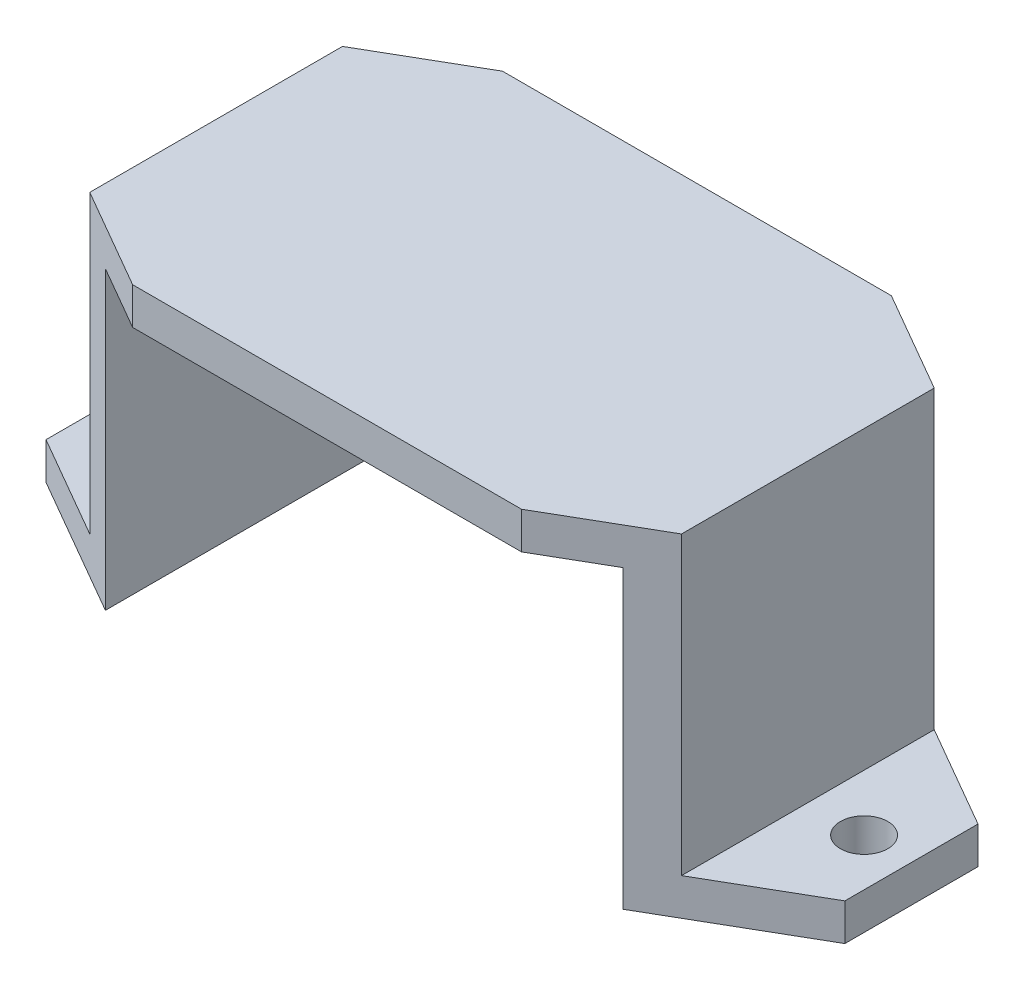
ISO-10303-21;
HEADER;
FILE_DESCRIPTION(('STEP AP214'),'2;1');
FILE_NAME('part.step','',(''),(''),'','','');
FILE_SCHEMA(('AUTOMOTIVE_DESIGN { 1 0 10303 214 1 1 1 1 }'));
ENDSEC;
DATA;
#1=APPLICATION_CONTEXT('core data for automotive mechanical design processes');
#2=APPLICATION_PROTOCOL_DEFINITION('international standard','automotive_design',2000,#1);
#3=PRODUCT_CONTEXT('',#1,'mechanical');
#4=PRODUCT('Part','Part','',(#3));
#5=PRODUCT_RELATED_PRODUCT_CATEGORY('part','',(#4));
#6=PRODUCT_DEFINITION_FORMATION('','',#4);
#7=PRODUCT_DEFINITION_CONTEXT('part definition',#1,'design');
#8=PRODUCT_DEFINITION('design','',#6,#7);
#9=PRODUCT_DEFINITION_SHAPE('','',#8);
#10=(LENGTH_UNIT() NAMED_UNIT(*) SI_UNIT(.MILLI.,.METRE.));
#11=(NAMED_UNIT(*) PLANE_ANGLE_UNIT() SI_UNIT($,.RADIAN.));
#12=(NAMED_UNIT(*) SI_UNIT($,.STERADIAN.) SOLID_ANGLE_UNIT());
#13=UNCERTAINTY_MEASURE_WITH_UNIT(LENGTH_MEASURE(1.E-05),#10,'distance_accuracy_value','');
#14=(GEOMETRIC_REPRESENTATION_CONTEXT(3) GLOBAL_UNCERTAINTY_ASSIGNED_CONTEXT((#13)) GLOBAL_UNIT_ASSIGNED_CONTEXT((#10,
#11,#12)) REPRESENTATION_CONTEXT('',''));
#15=CARTESIAN_POINT('',(0.,0.,0.));
#16=DIRECTION('',(0.,0.,1.));
#17=DIRECTION('',(1.,0.,0.));
#18=AXIS2_PLACEMENT_3D('',#15,#16,#17);
#19=CARTESIAN_POINT('',(47.,-2.5,25.));
#20=DIRECTION('',(0.,1.,0.));
#21=DIRECTION('',(0.,0.,1.));
#22=AXIS2_PLACEMENT_3D('',#19,#20,#21);
#23=PLANE('',#22);
#24=CARTESIAN_POINT('',(50.8,-2.5,12.5));
#25=DIRECTION('',(0.,1.,0.));
#26=DIRECTION('',(0.,0.,1.));
#27=AXIS2_PLACEMENT_3D('',#24,#25,#26);
#28=CIRCLE('',#27,1.6);
#29=CARTESIAN_POINT('',(50.8,-2.5,14.1));
#30=VERTEX_POINT('',#29);
#31=EDGE_CURVE('E297',#30,#30,#28,.T.);
#32=ORIENTED_EDGE('',*,*,#31,.T.);
#33=EDGE_LOOP('',(#32));
#34=FACE_BOUND('',#33,.T.);
#35=DIRECTION('',(0.,0.,-1.));
#36=VECTOR('',#35,1.);
#37=CARTESIAN_POINT('',(44.5,-2.5,25.));
#38=LINE('',#37,#36);
#39=CARTESIAN_POINT('',(44.5,-2.5,22.4848275573014));
#40=VERTEX_POINT('',#39);
#41=CARTESIAN_POINT('',(44.5,-2.5,2.51517244269858));
#42=VERTEX_POINT('',#41);
#43=EDGE_CURVE('E176',#40,#42,#38,.T.);
#44=ORIENTED_EDGE('',*,*,#43,.T.);
#45=DIRECTION('',(0.86602540378444,0.,0.499999999999998));
#46=VECTOR('',#45,1.);
#47=CARTESIAN_POINT('',(54.,-2.5,8.));
#48=LINE('',#47,#46);
#49=CARTESIAN_POINT('',(54.,-2.5,8.));
#50=VERTEX_POINT('',#49);
#51=EDGE_CURVE('E234',#42,#50,#48,.T.);
#52=ORIENTED_EDGE('',*,*,#51,.T.);
#53=DIRECTION('',(0.,0.,-1.));
#54=VECTOR('',#53,1.);
#55=CARTESIAN_POINT('',(54.,-2.5,25.));
#56=LINE('',#55,#54);
#57=CARTESIAN_POINT('',(54.,-2.5,17.));
#58=VERTEX_POINT('',#57);
#59=EDGE_CURVE('E217',#58,#50,#56,.T.);
#60=ORIENTED_EDGE('',*,*,#59,.F.);
#61=DIRECTION('',(-0.86602540378444,0.,0.499999999999998));
#62=VECTOR('',#61,1.);
#63=CARTESIAN_POINT('',(54.,-2.5,17.));
#64=LINE('',#63,#62);
#65=EDGE_CURVE('E304',#58,#40,#64,.T.);
#66=ORIENTED_EDGE('',*,*,#65,.T.);
#67=EDGE_LOOP('',(#44,#52,#60,#66));
#68=FACE_BOUND('',#67,.T.);
#69=ADVANCED_FACE('F43',(#34,#68),#23,.F.);
#70=CARTESIAN_POINT('',(54.,0.,25.));
#71=DIRECTION('',(1.,0.,0.));
#72=DIRECTION('',(0.,0.,-1.));
#73=AXIS2_PLACEMENT_3D('',#70,#71,#72);
#74=PLANE('',#73);
#75=DIRECTION('',(0.,1.,0.));
#76=VECTOR('',#75,1.);
#77=CARTESIAN_POINT('',(54.,-2.5,8.));
#78=LINE('',#77,#76);
#79=CARTESIAN_POINT('',(54.,0.,8.));
#80=VERTEX_POINT('',#79);
#81=EDGE_CURVE('E292',#50,#80,#78,.T.);
#82=ORIENTED_EDGE('',*,*,#81,.T.);
#83=DIRECTION('',(0.,0.,-1.));
#84=VECTOR('',#83,1.);
#85=CARTESIAN_POINT('',(54.,0.,25.));
#86=LINE('',#85,#84);
#87=CARTESIAN_POINT('',(54.,0.,17.));
#88=VERTEX_POINT('',#87);
#89=EDGE_CURVE('E214',#88,#80,#86,.T.);
#90=ORIENTED_EDGE('',*,*,#89,.F.);
#91=DIRECTION('',(0.,1.,0.));
#92=VECTOR('',#91,1.);
#93=CARTESIAN_POINT('',(54.,-2.5,17.));
#94=LINE('',#93,#92);
#95=EDGE_CURVE('E233',#58,#88,#94,.T.);
#96=ORIENTED_EDGE('',*,*,#95,.F.);
#97=ORIENTED_EDGE('',*,*,#59,.T.);
#98=EDGE_LOOP('',(#82,#90,#96,#97));
#99=FACE_BOUND('',#98,.T.);
#100=ADVANCED_FACE('F295',(#99),#74,.T.);
#101=CARTESIAN_POINT('',(47.,0.,25.));
#102=DIRECTION('',(0.,1.,0.));
#103=DIRECTION('',(0.,0.,1.));
#104=AXIS2_PLACEMENT_3D('',#101,#102,#103);
#105=PLANE('',#104);
#106=CARTESIAN_POINT('',(50.8,0.,12.5));
#107=DIRECTION('',(0.,1.,0.));
#108=DIRECTION('',(0.,0.,1.));
#109=AXIS2_PLACEMENT_3D('',#106,#107,#108);
#110=CIRCLE('',#109,1.6);
#111=CARTESIAN_POINT('',(50.8,0.,14.1));
#112=VERTEX_POINT('',#111);
#113=EDGE_CURVE('E301',#112,#112,#110,.T.);
#114=ORIENTED_EDGE('',*,*,#113,.F.);
#115=EDGE_LOOP('',(#114));
#116=FACE_BOUND('',#115,.T.);
#117=DIRECTION('',(0.86602540378444,0.,0.499999999999998));
#118=VECTOR('',#117,1.);
#119=CARTESIAN_POINT('',(56.1112159321677,0.,9.21891108675444));
#120=LINE('',#119,#118);
#121=CARTESIAN_POINT('',(47.,0.,3.95854811567264));
#122=VERTEX_POINT('',#121);
#123=EDGE_CURVE('E264',#122,#80,#120,.T.);
#124=ORIENTED_EDGE('',*,*,#123,.F.);
#125=DIRECTION('',(0.,0.,-1.));
#126=VECTOR('',#125,1.);
#127=CARTESIAN_POINT('',(47.,0.,25.));
#128=LINE('',#127,#126);
#129=CARTESIAN_POINT('',(47.,0.,21.0414518843274));
#130=VERTEX_POINT('',#129);
#131=EDGE_CURVE('E211',#130,#122,#128,.T.);
#132=ORIENTED_EDGE('',*,*,#131,.F.);
#133=DIRECTION('',(-0.86602540378444,0.,0.499999999999998));
#134=VECTOR('',#133,1.);
#135=CARTESIAN_POINT('',(45.2858983848622,0.,22.0310889132455));
#136=LINE('',#135,#134);
#137=EDGE_CURVE('E182',#88,#130,#136,.T.);
#138=ORIENTED_EDGE('',*,*,#137,.F.);
#139=ORIENTED_EDGE('',*,*,#89,.T.);
#140=EDGE_LOOP('',(#124,#132,#138,#139));
#141=FACE_BOUND('',#140,.T.);
#142=ADVANCED_FACE('F290',(#116,#141),#105,.T.);
#143=CARTESIAN_POINT('',(47.,20.,25.));
#144=DIRECTION('',(1.,0.,0.));
#145=DIRECTION('',(0.,0.,-1.));
#146=AXIS2_PLACEMENT_3D('',#143,#144,#145);
#147=PLANE('',#146);
#148=DIRECTION('',(0.,-1.,0.));
#149=VECTOR('',#148,1.);
#150=CARTESIAN_POINT('',(47.,20.,3.95854811567264));
#151=LINE('',#150,#149);
#152=CARTESIAN_POINT('',(47.,20.,3.95854811567264));
#153=VERTEX_POINT('',#152);
#154=EDGE_CURVE('E262',#153,#122,#151,.T.);
#155=ORIENTED_EDGE('',*,*,#154,.F.);
#156=DIRECTION('',(0.,0.,-1.));
#157=VECTOR('',#156,1.);
#158=CARTESIAN_POINT('',(47.,20.,25.));
#159=LINE('',#158,#157);
#160=CARTESIAN_POINT('',(47.,20.,21.0414518843274));
#161=VERTEX_POINT('',#160);
#162=EDGE_CURVE('E208',#161,#153,#159,.T.);
#163=ORIENTED_EDGE('',*,*,#162,.F.);
#164=DIRECTION('',(0.,1.,0.));
#165=VECTOR('',#164,1.);
#166=CARTESIAN_POINT('',(47.,20.,21.0414518843274));
#167=LINE('',#166,#165);
#168=EDGE_CURVE('E279',#130,#161,#167,.T.);
#169=ORIENTED_EDGE('',*,*,#168,.F.);
#170=ORIENTED_EDGE('',*,*,#131,.T.);
#171=EDGE_LOOP('',(#155,#163,#169,#170));
#172=FACE_BOUND('',#171,.T.);
#173=ADVANCED_FACE('F288',(#172),#147,.T.);
#174=CARTESIAN_POINT('',(7.,20.,25.));
#175=DIRECTION('',(0.,1.,0.));
#176=DIRECTION('',(0.,0.,1.));
#177=AXIS2_PLACEMENT_3D('',#174,#175,#176);
#178=PLANE('',#177);
#179=DIRECTION('',(0.86602540378444,0.,0.499999999999998));
#180=VECTOR('',#179,1.);
#181=CARTESIAN_POINT('',(54.,20.,8.));
#182=LINE('',#181,#180);
#183=CARTESIAN_POINT('',(40.1435935394489,20.,0.));
#184=VERTEX_POINT('',#183);
#185=EDGE_CURVE('E225',#184,#153,#182,.T.);
#186=ORIENTED_EDGE('',*,*,#185,.F.);
#187=DIRECTION('',(1.,0.,0.));
#188=VECTOR('',#187,1.);
#189=CARTESIAN_POINT('',(7.,20.,0.));
#190=LINE('',#189,#188);
#191=CARTESIAN_POINT('',(13.8564064605511,20.,0.));
#192=VERTEX_POINT('',#191);
#193=EDGE_CURVE('E179',#192,#184,#190,.T.);
#194=ORIENTED_EDGE('',*,*,#193,.F.);
#195=DIRECTION('',(0.86602540378444,0.,-0.499999999999998));
#196=VECTOR('',#195,1.);
#197=CARTESIAN_POINT('',(0.,20.,8.));
#198=LINE('',#197,#196);
#199=CARTESIAN_POINT('',(7.,20.,3.95854811567264));
#200=VERTEX_POINT('',#199);
#201=EDGE_CURVE('E169',#200,#192,#198,.T.);
#202=ORIENTED_EDGE('',*,*,#201,.F.);
#203=DIRECTION('',(0.,0.,-1.));
#204=VECTOR('',#203,1.);
#205=CARTESIAN_POINT('',(7.,20.,25.));
#206=LINE('',#205,#204);
#207=CARTESIAN_POINT('',(7.,20.,21.0414518843274));
#208=VERTEX_POINT('',#207);
#209=EDGE_CURVE('E168',#208,#200,#206,.T.);
#210=ORIENTED_EDGE('',*,*,#209,.F.);
#211=DIRECTION('',(-0.86602540378444,0.,-0.499999999999998));
#212=VECTOR('',#211,1.);
#213=CARTESIAN_POINT('',(0.,20.,17.));
#214=LINE('',#213,#212);
#215=CARTESIAN_POINT('',(13.8564064605511,20.,25.));
#216=VERTEX_POINT('',#215);
#217=EDGE_CURVE('E153',#216,#208,#214,.T.);
#218=ORIENTED_EDGE('',*,*,#217,.F.);
#219=DIRECTION('',(1.,0.,0.));
#220=VECTOR('',#219,1.);
#221=CARTESIAN_POINT('',(7.,20.,25.));
#222=LINE('',#221,#220);
#223=CARTESIAN_POINT('',(40.1435935394489,20.,25.));
#224=VERTEX_POINT('',#223);
#225=EDGE_CURVE('E165',#216,#224,#222,.T.);
#226=ORIENTED_EDGE('',*,*,#225,.T.);
#227=DIRECTION('',(-0.86602540378444,0.,0.499999999999998));
#228=VECTOR('',#227,1.);
#229=CARTESIAN_POINT('',(54.,20.,17.));
#230=LINE('',#229,#228);
#231=EDGE_CURVE('E65',#161,#224,#230,.T.);
#232=ORIENTED_EDGE('',*,*,#231,.F.);
#233=ORIENTED_EDGE('',*,*,#162,.T.);
#234=EDGE_LOOP('',(#186,#194,#202,#210,#218,#226,#232,#233));
#235=FACE_BOUND('',#234,.T.);
#236=ADVANCED_FACE('F164',(#235),#178,.T.);
#237=CARTESIAN_POINT('',(7.,0.,25.));
#238=DIRECTION('',(-1.,0.,0.));
#239=DIRECTION('',(0.,0.,1.));
#240=AXIS2_PLACEMENT_3D('',#237,#238,#239);
#241=PLANE('',#240);
#242=DIRECTION('',(0.,-1.,0.));
#243=VECTOR('',#242,1.);
#244=CARTESIAN_POINT('',(7.,0.,21.0414518843274));
#245=LINE('',#244,#243);
#246=CARTESIAN_POINT('',(7.,0.,21.0414518843274));
#247=VERTEX_POINT('',#246);
#248=EDGE_CURVE('E272',#208,#247,#245,.T.);
#249=ORIENTED_EDGE('',*,*,#248,.F.);
#250=ORIENTED_EDGE('',*,*,#209,.T.);
#251=DIRECTION('',(0.,1.,0.));
#252=VECTOR('',#251,1.);
#253=CARTESIAN_POINT('',(7.,0.,3.95854811567264));
#254=LINE('',#253,#252);
#255=CARTESIAN_POINT('',(7.,0.,3.95854811567264));
#256=VERTEX_POINT('',#255);
#257=EDGE_CURVE('E256',#256,#200,#254,.T.);
#258=ORIENTED_EDGE('',*,*,#257,.F.);
#259=DIRECTION('',(0.,0.,-1.));
#260=VECTOR('',#259,1.);
#261=CARTESIAN_POINT('',(7.,0.,25.));
#262=LINE('',#261,#260);
#263=EDGE_CURVE('E204',#247,#256,#262,.T.);
#264=ORIENTED_EDGE('',*,*,#263,.F.);
#265=EDGE_LOOP('',(#249,#250,#258,#264));
#266=FACE_BOUND('',#265,.T.);
#267=ADVANCED_FACE('F389',(#266),#241,.T.);
#268=CARTESIAN_POINT('',(0.,0.,25.));
#269=DIRECTION('',(0.,1.,0.));
#270=DIRECTION('',(0.,0.,1.));
#271=AXIS2_PLACEMENT_3D('',#268,#269,#270);
#272=PLANE('',#271);
#273=CARTESIAN_POINT('',(3.2,0.,12.5));
#274=DIRECTION('',(0.,1.,0.));
#275=DIRECTION('',(0.,0.,1.));
#276=AXIS2_PLACEMENT_3D('',#273,#274,#275);
#277=CIRCLE('',#276,1.6);
#278=CARTESIAN_POINT('',(3.2,0.,14.1));
#279=VERTEX_POINT('',#278);
#280=EDGE_CURVE('E331',#279,#279,#277,.T.);
#281=ORIENTED_EDGE('',*,*,#280,.F.);
#282=EDGE_LOOP('',(#281));
#283=FACE_BOUND('',#282,.T.);
#284=DIRECTION('',(-0.86602540378444,0.,-0.499999999999998));
#285=VECTOR('',#284,1.);
#286=CARTESIAN_POINT('',(3.46410161513775,0.,19.));
#287=LINE('',#286,#285);
#288=CARTESIAN_POINT('',(0.,0.,17.));
#289=VERTEX_POINT('',#288);
#290=EDGE_CURVE('E270',#247,#289,#287,.T.);
#291=ORIENTED_EDGE('',*,*,#290,.F.);
#292=ORIENTED_EDGE('',*,*,#263,.T.);
#293=DIRECTION('',(0.86602540378444,0.,-0.499999999999998));
#294=VECTOR('',#293,1.);
#295=CARTESIAN_POINT('',(-7.36121593216771,0.,12.25));
#296=LINE('',#295,#294);
#297=CARTESIAN_POINT('',(0.,0.,8.));
#298=VERTEX_POINT('',#297);
#299=EDGE_CURVE('E249',#298,#256,#296,.T.);
#300=ORIENTED_EDGE('',*,*,#299,.F.);
#301=DIRECTION('',(0.,0.,-1.));
#302=VECTOR('',#301,1.);
#303=CARTESIAN_POINT('',(0.,0.,25.));
#304=LINE('',#303,#302);
#305=EDGE_CURVE('E201',#289,#298,#304,.T.);
#306=ORIENTED_EDGE('',*,*,#305,.F.);
#307=EDGE_LOOP('',(#291,#292,#300,#306));
#308=FACE_BOUND('',#307,.T.);
#309=ADVANCED_FACE('F386',(#283,#308),#272,.T.);
#310=CARTESIAN_POINT('',(0.,-2.5,25.));
#311=DIRECTION('',(-1.,0.,0.));
#312=DIRECTION('',(0.,0.,1.));
#313=AXIS2_PLACEMENT_3D('',#310,#311,#312);
#314=PLANE('',#313);
#315=DIRECTION('',(0.,1.,0.));
#316=VECTOR('',#315,1.);
#317=CARTESIAN_POINT('',(0.,-2.5,17.));
#318=LINE('',#317,#316);
#319=CARTESIAN_POINT('',(0.,-2.5,17.));
#320=VERTEX_POINT('',#319);
#321=EDGE_CURVE('E322',#320,#289,#318,.T.);
#322=ORIENTED_EDGE('',*,*,#321,.T.);
#323=ORIENTED_EDGE('',*,*,#305,.T.);
#324=DIRECTION('',(0.,1.,0.));
#325=VECTOR('',#324,1.);
#326=CARTESIAN_POINT('',(0.,-2.5,8.));
#327=LINE('',#326,#325);
#328=CARTESIAN_POINT('',(0.,-2.5,8.));
#329=VERTEX_POINT('',#328);
#330=EDGE_CURVE('E247',#329,#298,#327,.T.);
#331=ORIENTED_EDGE('',*,*,#330,.F.);
#332=DIRECTION('',(0.,0.,-1.));
#333=VECTOR('',#332,1.);
#334=CARTESIAN_POINT('',(0.,-2.5,25.));
#335=LINE('',#334,#333);
#336=EDGE_CURVE('E198',#320,#329,#335,.T.);
#337=ORIENTED_EDGE('',*,*,#336,.F.);
#338=EDGE_LOOP('',(#322,#323,#331,#337));
#339=FACE_BOUND('',#338,.T.);
#340=ADVANCED_FACE('F382',(#339),#314,.T.);
#341=CARTESIAN_POINT('',(0.,-2.5,25.));
#342=DIRECTION('',(0.,1.,0.));
#343=DIRECTION('',(0.,0.,1.));
#344=AXIS2_PLACEMENT_3D('',#341,#342,#343);
#345=PLANE('',#344);
#346=CARTESIAN_POINT('',(3.2,-2.5,12.5));
#347=DIRECTION('',(0.,1.,0.));
#348=DIRECTION('',(0.,0.,1.));
#349=AXIS2_PLACEMENT_3D('',#346,#347,#348);
#350=CIRCLE('',#349,1.6);
#351=CARTESIAN_POINT('',(3.2,-2.5,14.1));
#352=VERTEX_POINT('',#351);
#353=EDGE_CURVE('E328',#352,#352,#350,.T.);
#354=ORIENTED_EDGE('',*,*,#353,.T.);
#355=EDGE_LOOP('',(#354));
#356=FACE_BOUND('',#355,.T.);
#357=DIRECTION('',(0.,0.,-1.));
#358=VECTOR('',#357,1.);
#359=CARTESIAN_POINT('',(9.5,-2.5,25.));
#360=LINE('',#359,#358);
#361=CARTESIAN_POINT('',(9.5,-2.5,22.4848275573014));
#362=VERTEX_POINT('',#361);
#363=CARTESIAN_POINT('',(9.5,-2.5,2.51517244269858));
#364=VERTEX_POINT('',#363);
#365=EDGE_CURVE('E195',#362,#364,#360,.T.);
#366=ORIENTED_EDGE('',*,*,#365,.F.);
#367=DIRECTION('',(-0.86602540378444,0.,-0.499999999999998));
#368=VECTOR('',#367,1.);
#369=CARTESIAN_POINT('',(0.,-2.5,17.));
#370=LINE('',#369,#368);
#371=EDGE_CURVE('E170',#362,#320,#370,.T.);
#372=ORIENTED_EDGE('',*,*,#371,.T.);
#373=ORIENTED_EDGE('',*,*,#336,.T.);
#374=DIRECTION('',(0.86602540378444,0.,-0.499999999999998));
#375=VECTOR('',#374,1.);
#376=CARTESIAN_POINT('',(0.,-2.5,8.));
#377=LINE('',#376,#375);
#378=EDGE_CURVE('E251',#329,#364,#377,.T.);
#379=ORIENTED_EDGE('',*,*,#378,.T.);
#380=EDGE_LOOP('',(#366,#372,#373,#379));
#381=FACE_BOUND('',#380,.T.);
#382=ADVANCED_FACE('F310',(#356,#381),#345,.F.);
#383=CARTESIAN_POINT('',(9.5,0.,25.));
#384=DIRECTION('',(-1.,0.,0.));
#385=DIRECTION('',(0.,0.,1.));
#386=AXIS2_PLACEMENT_3D('',#383,#384,#385);
#387=PLANE('',#386);
#388=DIRECTION('',(0.,0.,-1.));
#389=VECTOR('',#388,1.);
#390=CARTESIAN_POINT('',(9.5,17.5,25.));
#391=LINE('',#390,#389);
#392=CARTESIAN_POINT('',(9.5,17.5,22.4848275573014));
#393=VERTEX_POINT('',#392);
#394=CARTESIAN_POINT('',(9.5,17.5,2.51517244269858));
#395=VERTEX_POINT('',#394);
#396=EDGE_CURVE('E192',#393,#395,#391,.T.);
#397=ORIENTED_EDGE('',*,*,#396,.F.);
#398=DIRECTION('',(0.,-1.,0.));
#399=VECTOR('',#398,1.);
#400=CARTESIAN_POINT('',(9.5,0.,22.4848275573014));
#401=LINE('',#400,#399);
#402=EDGE_CURVE('E267',#393,#362,#401,.T.);
#403=ORIENTED_EDGE('',*,*,#402,.T.);
#404=ORIENTED_EDGE('',*,*,#365,.T.);
#405=DIRECTION('',(0.,1.,0.));
#406=VECTOR('',#405,1.);
#407=CARTESIAN_POINT('',(9.5,0.,2.51517244269859));
#408=LINE('',#407,#406);
#409=EDGE_CURVE('E246',#364,#395,#408,.T.);
#410=ORIENTED_EDGE('',*,*,#409,.T.);
#411=EDGE_LOOP('',(#397,#403,#404,#410));
#412=FACE_BOUND('',#411,.T.);
#413=ADVANCED_FACE('F315',(#412),#387,.F.);
#414=CARTESIAN_POINT('',(7.,17.5,25.));
#415=DIRECTION('',(0.,1.,0.));
#416=DIRECTION('',(0.,0.,1.));
#417=AXIS2_PLACEMENT_3D('',#414,#415,#416);
#418=PLANE('',#417);
#419=DIRECTION('',(1.,0.,0.));
#420=VECTOR('',#419,1.);
#421=CARTESIAN_POINT('',(7.,17.5,0.));
#422=LINE('',#421,#420);
#423=CARTESIAN_POINT('',(13.8564064605511,17.5,0.));
#424=VERTEX_POINT('',#423);
#425=CARTESIAN_POINT('',(40.1435935394489,17.5,0.));
#426=VERTEX_POINT('',#425);
#427=EDGE_CURVE('E174',#424,#426,#422,.T.);
#428=ORIENTED_EDGE('',*,*,#427,.T.);
#429=DIRECTION('',(0.86602540378444,0.,0.499999999999998));
#430=VECTOR('',#429,1.);
#431=CARTESIAN_POINT('',(26.1112159321676,17.5,-8.10159698893429));
#432=LINE('',#431,#430);
#433=CARTESIAN_POINT('',(44.5,17.5,2.51517244269858));
#434=VERTEX_POINT('',#433);
#435=EDGE_CURVE('E228',#426,#434,#432,.T.);
#436=ORIENTED_EDGE('',*,*,#435,.T.);
#437=DIRECTION('',(0.,0.,-1.));
#438=VECTOR('',#437,1.);
#439=CARTESIAN_POINT('',(44.5,17.5,25.));
#440=LINE('',#439,#438);
#441=CARTESIAN_POINT('',(44.5,17.5,22.4848275573014));
#442=VERTEX_POINT('',#441);
#443=EDGE_CURVE('E189',#442,#434,#440,.T.);
#444=ORIENTED_EDGE('',*,*,#443,.F.);
#445=DIRECTION('',(-0.86602540378444,0.,0.499999999999998));
#446=VECTOR('',#445,1.);
#447=CARTESIAN_POINT('',(15.2858983848622,17.5,39.3515969889342));
#448=LINE('',#447,#446);
#449=CARTESIAN_POINT('',(40.1435935394489,17.5,25.));
#450=VERTEX_POINT('',#449);
#451=EDGE_CURVE('E277',#442,#450,#448,.T.);
#452=ORIENTED_EDGE('',*,*,#451,.T.);
#453=DIRECTION('',(1.,0.,0.));
#454=VECTOR('',#453,1.);
#455=CARTESIAN_POINT('',(7.,17.5,25.));
#456=LINE('',#455,#454);
#457=CARTESIAN_POINT('',(13.8564064605511,17.5,25.));
#458=VERTEX_POINT('',#457);
#459=EDGE_CURVE('E173',#458,#450,#456,.T.);
#460=ORIENTED_EDGE('',*,*,#459,.F.);
#461=DIRECTION('',(-0.86602540378444,0.,-0.499999999999998));
#462=VECTOR('',#461,1.);
#463=CARTESIAN_POINT('',(8.71410161513776,17.5,22.0310889132455));
#464=LINE('',#463,#462);
#465=EDGE_CURVE('E57',#458,#393,#464,.T.);
#466=ORIENTED_EDGE('',*,*,#465,.T.);
#467=ORIENTED_EDGE('',*,*,#396,.T.);
#468=DIRECTION('',(0.86602540378444,0.,-0.499999999999998));
#469=VECTOR('',#468,1.);
#470=CARTESIAN_POINT('',(-2.1112159321677,17.5,9.21891108675444));
#471=LINE('',#470,#469);
#472=EDGE_CURVE('E241',#395,#424,#471,.T.);
#473=ORIENTED_EDGE('',*,*,#472,.T.);
#474=EDGE_LOOP('',(#428,#436,#444,#452,#460,#466,#467,#473));
#475=FACE_BOUND('',#474,.T.);
#476=ADVANCED_FACE('F244',(#475),#418,.F.);
#477=CARTESIAN_POINT('',(44.5,20.,25.));
#478=DIRECTION('',(1.,0.,0.));
#479=DIRECTION('',(0.,0.,-1.));
#480=AXIS2_PLACEMENT_3D('',#477,#478,#479);
#481=PLANE('',#480);
#482=ORIENTED_EDGE('',*,*,#443,.T.);
#483=DIRECTION('',(0.,-1.,0.));
#484=VECTOR('',#483,1.);
#485=CARTESIAN_POINT('',(44.5,20.,2.51517244269858));
#486=LINE('',#485,#484);
#487=EDGE_CURVE('E258',#434,#42,#486,.T.);
#488=ORIENTED_EDGE('',*,*,#487,.T.);
#489=ORIENTED_EDGE('',*,*,#43,.F.);
#490=DIRECTION('',(0.,1.,0.));
#491=VECTOR('',#490,1.);
#492=CARTESIAN_POINT('',(44.5,20.,22.4848275573014));
#493=LINE('',#492,#491);
#494=EDGE_CURVE('E274',#40,#442,#493,.T.);
#495=ORIENTED_EDGE('',*,*,#494,.T.);
#496=EDGE_LOOP('',(#482,#488,#489,#495));
#497=FACE_BOUND('',#496,.T.);
#498=ADVANCED_FACE('F320',(#497),#481,.F.);
#499=CARTESIAN_POINT('',(0.,0.,25.));
#500=DIRECTION('',(0.,0.,-1.));
#501=DIRECTION('',(-1.,0.,0.));
#502=AXIS2_PLACEMENT_3D('',#499,#500,#501);
#503=PLANE('',#502);
#504=ORIENTED_EDGE('',*,*,#459,.T.);
#505=DIRECTION('',(0.,1.,0.));
#506=VECTOR('',#505,1.);
#507=CARTESIAN_POINT('',(40.1435935394489,0.,25.));
#508=LINE('',#507,#506);
#509=EDGE_CURVE('E12',#450,#224,#508,.T.);
#510=ORIENTED_EDGE('',*,*,#509,.T.);
#511=ORIENTED_EDGE('',*,*,#225,.F.);
#512=DIRECTION('',(0.,-1.,0.));
#513=VECTOR('',#512,1.);
#514=CARTESIAN_POINT('',(13.8564064605511,0.,25.));
#515=LINE('',#514,#513);
#516=EDGE_CURVE('E50',#216,#458,#515,.T.);
#517=ORIENTED_EDGE('',*,*,#516,.T.);
#518=EDGE_LOOP('',(#504,#510,#511,#517));
#519=FACE_BOUND('',#518,.T.);
#520=ADVANCED_FACE('F172',(#519),#503,.F.);
#521=CARTESIAN_POINT('',(0.,0.,0.));
#522=DIRECTION('',(0.,0.,-1.));
#523=DIRECTION('',(-1.,0.,0.));
#524=AXIS2_PLACEMENT_3D('',#521,#522,#523);
#525=PLANE('',#524);
#526=DIRECTION('',(0.,1.,0.));
#527=VECTOR('',#526,1.);
#528=CARTESIAN_POINT('',(40.1435935394489,0.,0.));
#529=LINE('',#528,#527);
#530=EDGE_CURVE('E159',#426,#184,#529,.T.);
#531=ORIENTED_EDGE('',*,*,#530,.F.);
#532=ORIENTED_EDGE('',*,*,#427,.F.);
#533=DIRECTION('',(0.,-1.,0.));
#534=VECTOR('',#533,1.);
#535=CARTESIAN_POINT('',(13.8564064605511,0.,0.));
#536=LINE('',#535,#534);
#537=EDGE_CURVE('E220',#192,#424,#536,.T.);
#538=ORIENTED_EDGE('',*,*,#537,.F.);
#539=ORIENTED_EDGE('',*,*,#193,.T.);
#540=EDGE_LOOP('',(#531,#532,#538,#539));
#541=FACE_BOUND('',#540,.T.);
#542=ADVANCED_FACE('F237',(#541),#525,.T.);
#543=CARTESIAN_POINT('',(0.,-2.5,8.));
#544=DIRECTION('',(0.499999999999998,0.,0.86602540378444));
#545=DIRECTION('',(0.86602540378444,0.,-0.499999999999998));
#546=AXIS2_PLACEMENT_3D('',#543,#544,#545);
#547=PLANE('',#546);
#548=ORIENTED_EDGE('',*,*,#257,.T.);
#549=ORIENTED_EDGE('',*,*,#201,.T.);
#550=ORIENTED_EDGE('',*,*,#537,.T.);
#551=ORIENTED_EDGE('',*,*,#472,.F.);
#552=ORIENTED_EDGE('',*,*,#409,.F.);
#553=ORIENTED_EDGE('',*,*,#378,.F.);
#554=ORIENTED_EDGE('',*,*,#330,.T.);
#555=ORIENTED_EDGE('',*,*,#299,.T.);
#556=EDGE_LOOP('',(#548,#549,#550,#551,#552,#553,#554,#555));
#557=FACE_BOUND('',#556,.T.);
#558=ADVANCED_FACE('F240',(#557),#547,.F.);
#559=CARTESIAN_POINT('',(54.,-2.5,8.));
#560=DIRECTION('',(-0.499999999999998,0.,0.86602540378444));
#561=DIRECTION('',(0.86602540378444,0.,0.499999999999998));
#562=AXIS2_PLACEMENT_3D('',#559,#560,#561);
#563=PLANE('',#562);
#564=ORIENTED_EDGE('',*,*,#123,.T.);
#565=ORIENTED_EDGE('',*,*,#81,.F.);
#566=ORIENTED_EDGE('',*,*,#51,.F.);
#567=ORIENTED_EDGE('',*,*,#487,.F.);
#568=ORIENTED_EDGE('',*,*,#435,.F.);
#569=ORIENTED_EDGE('',*,*,#530,.T.);
#570=ORIENTED_EDGE('',*,*,#185,.T.);
#571=ORIENTED_EDGE('',*,*,#154,.T.);
#572=EDGE_LOOP('',(#564,#565,#566,#567,#568,#569,#570,#571));
#573=FACE_BOUND('',#572,.T.);
#574=ADVANCED_FACE('F224',(#573),#563,.F.);
#575=CARTESIAN_POINT('',(0.,-2.5,17.));
#576=DIRECTION('',(0.499999999999998,0.,-0.86602540378444));
#577=DIRECTION('',(-0.86602540378444,0.,-0.499999999999998));
#578=AXIS2_PLACEMENT_3D('',#575,#576,#577);
#579=PLANE('',#578);
#580=ORIENTED_EDGE('',*,*,#248,.T.);
#581=ORIENTED_EDGE('',*,*,#290,.T.);
#582=ORIENTED_EDGE('',*,*,#321,.F.);
#583=ORIENTED_EDGE('',*,*,#371,.F.);
#584=ORIENTED_EDGE('',*,*,#402,.F.);
#585=ORIENTED_EDGE('',*,*,#465,.F.);
#586=ORIENTED_EDGE('',*,*,#516,.F.);
#587=ORIENTED_EDGE('',*,*,#217,.T.);
#588=EDGE_LOOP('',(#580,#581,#582,#583,#584,#585,#586,#587));
#589=FACE_BOUND('',#588,.T.);
#590=ADVANCED_FACE('F152',(#589),#579,.F.);
#591=CARTESIAN_POINT('',(54.,-2.5,17.));
#592=DIRECTION('',(-0.499999999999998,0.,-0.86602540378444));
#593=DIRECTION('',(-0.86602540378444,0.,0.499999999999998));
#594=AXIS2_PLACEMENT_3D('',#591,#592,#593);
#595=PLANE('',#594);
#596=ORIENTED_EDGE('',*,*,#137,.T.);
#597=ORIENTED_EDGE('',*,*,#168,.T.);
#598=ORIENTED_EDGE('',*,*,#231,.T.);
#599=ORIENTED_EDGE('',*,*,#509,.F.);
#600=ORIENTED_EDGE('',*,*,#451,.F.);
#601=ORIENTED_EDGE('',*,*,#494,.F.);
#602=ORIENTED_EDGE('',*,*,#65,.F.);
#603=ORIENTED_EDGE('',*,*,#95,.T.);
#604=EDGE_LOOP('',(#596,#597,#598,#599,#600,#601,#602,#603));
#605=FACE_BOUND('',#604,.T.);
#606=ADVANCED_FACE('F282',(#605),#595,.F.);
#607=CARTESIAN_POINT('',(3.2,-2.5,12.5));
#608=DIRECTION('',(0.,1.,0.));
#609=DIRECTION('',(0.,0.,1.));
#610=AXIS2_PLACEMENT_3D('',#607,#608,#609);
#611=CYLINDRICAL_SURFACE('',#610,1.6);
#612=ORIENTED_EDGE('',*,*,#353,.F.);
#613=EDGE_LOOP('',(#612));
#614=FACE_BOUND('',#613,.T.);
#615=ORIENTED_EDGE('',*,*,#280,.T.);
#616=EDGE_LOOP('',(#615));
#617=FACE_BOUND('',#616,.T.);
#618=ADVANCED_FACE('F355',(#614,#617),#611,.F.);
#619=CARTESIAN_POINT('',(50.8,-2.5,12.5));
#620=DIRECTION('',(0.,1.,0.));
#621=DIRECTION('',(0.,0.,1.));
#622=AXIS2_PLACEMENT_3D('',#619,#620,#621);
#623=CYLINDRICAL_SURFACE('',#622,1.6);
#624=ORIENTED_EDGE('',*,*,#31,.F.);
#625=EDGE_LOOP('',(#624));
#626=FACE_BOUND('',#625,.T.);
#627=ORIENTED_EDGE('',*,*,#113,.T.);
#628=EDGE_LOOP('',(#627));
#629=FACE_BOUND('',#628,.T.);
#630=ADVANCED_FACE('F337',(#626,#629),#623,.F.);
#631=CLOSED_SHELL('',(#69,#100,#142,#173,#236,#267,#309,#340,#382,#413,#476,#498,#520,#542,#558,
#574,#590,#606,#618,#630));
#632=MANIFOLD_SOLID_BREP('B2',#631);
#633=ADVANCED_BREP_SHAPE_REPRESENTATION('',(#18,#632),#14);
#634=SHAPE_DEFINITION_REPRESENTATION(#9,#633);
ENDSEC;
END-ISO-10303-21;
